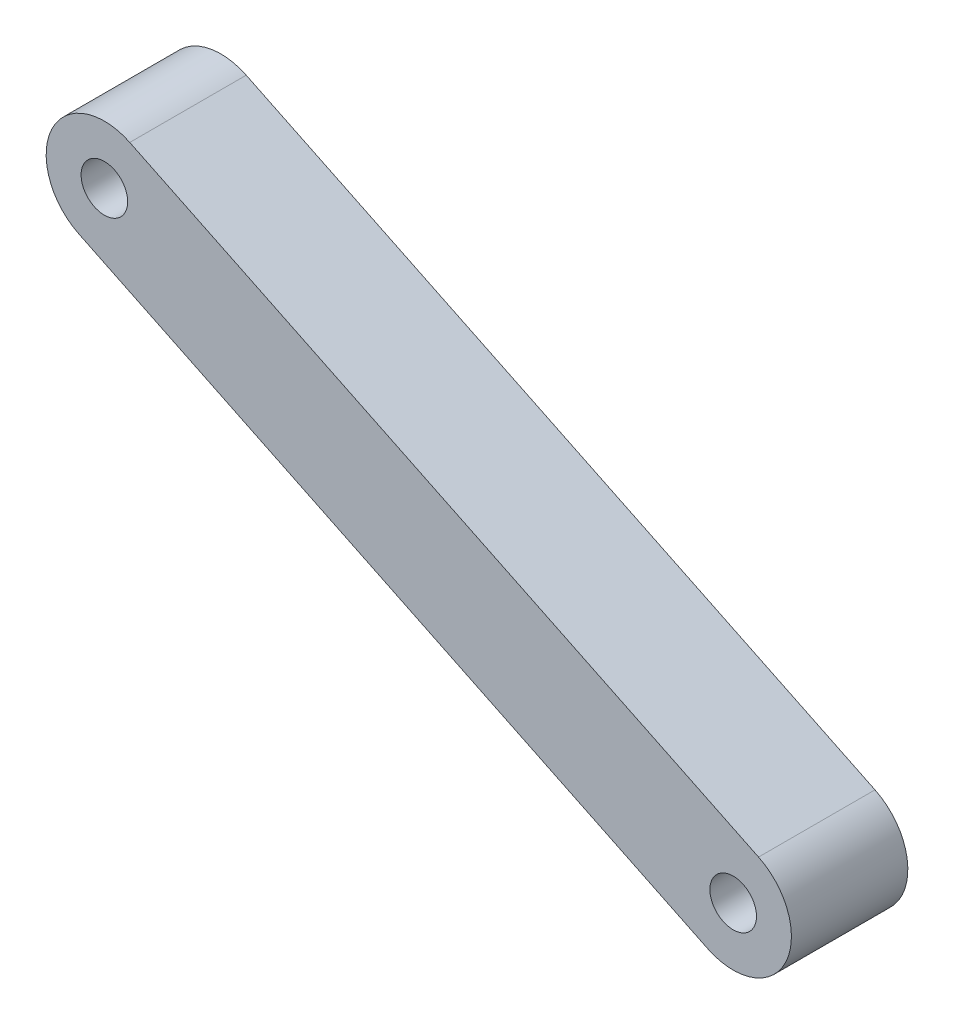
ISO-10303-21;
HEADER;
FILE_DESCRIPTION(('STEP AP214'),'2;1');
FILE_NAME('part.step','',(''),(''),'','','');
FILE_SCHEMA(('AUTOMOTIVE_DESIGN { 1 0 10303 214 1 1 1 1 }'));
ENDSEC;
DATA;
#1=APPLICATION_CONTEXT('core data for automotive mechanical design processes');
#2=APPLICATION_PROTOCOL_DEFINITION('international standard','automotive_design',2000,#1);
#3=PRODUCT_CONTEXT('',#1,'mechanical');
#4=PRODUCT('Part','Part','',(#3));
#5=PRODUCT_RELATED_PRODUCT_CATEGORY('part','',(#4));
#6=PRODUCT_DEFINITION_FORMATION('','',#4);
#7=PRODUCT_DEFINITION_CONTEXT('part definition',#1,'design');
#8=PRODUCT_DEFINITION('design','',#6,#7);
#9=PRODUCT_DEFINITION_SHAPE('','',#8);
#10=(LENGTH_UNIT() NAMED_UNIT(*) SI_UNIT(.MILLI.,.METRE.));
#11=(NAMED_UNIT(*) PLANE_ANGLE_UNIT() SI_UNIT($,.RADIAN.));
#12=(NAMED_UNIT(*) SI_UNIT($,.STERADIAN.) SOLID_ANGLE_UNIT());
#13=UNCERTAINTY_MEASURE_WITH_UNIT(LENGTH_MEASURE(1.E-05),#10,'distance_accuracy_value','');
#14=(GEOMETRIC_REPRESENTATION_CONTEXT(3) GLOBAL_UNCERTAINTY_ASSIGNED_CONTEXT((#13)) GLOBAL_UNIT_ASSIGNED_CONTEXT((#10,
#11,#12)) REPRESENTATION_CONTEXT('',''));
#15=CARTESIAN_POINT('',(0.,0.,0.));
#16=DIRECTION('',(0.,0.,1.));
#17=DIRECTION('',(1.,0.,0.));
#18=AXIS2_PLACEMENT_3D('',#15,#16,#17);
#19=CARTESIAN_POINT('',(-59.1343390927748,15.7528711445072,10.));
#20=DIRECTION('',(0.,0.,1.));
#21=DIRECTION('',(1.,0.,0.));
#22=AXIS2_PLACEMENT_3D('',#19,#20,#21);
#23=PLANE('',#22);
#24=CARTESIAN_POINT('',(-59.1343390927748,15.7528711445072,10.));
#25=DIRECTION('',(0.,0.,1.));
#26=DIRECTION('',(1.,0.,0.));
#27=AXIS2_PLACEMENT_3D('',#24,#25,#26);
#28=CIRCLE('',#27,2.);
#29=CARTESIAN_POINT('',(-57.1343390927748,15.7528711445072,10.));
#30=VERTEX_POINT('',#29);
#31=EDGE_CURVE('E103',#30,#30,#28,.T.);
#32=ORIENTED_EDGE('',*,*,#31,.F.);
#33=EDGE_LOOP('',(#32));
#34=FACE_BOUND('',#33,.T.);
#35=CARTESIAN_POINT('',(-59.1343390927748,15.7528711445072,10.));
#36=DIRECTION('',(0.,0.,1.));
#37=DIRECTION('',(1.,0.,0.));
#38=AXIS2_PLACEMENT_3D('',#35,#36,#37);
#39=CIRCLE('',#38,5.);
#40=CARTESIAN_POINT('',(-56.9551455274455,20.2529950766703,10.));
#41=VERTEX_POINT('',#40);
#42=CARTESIAN_POINT('',(-61.3135326581041,11.252747212344,10.));
#43=VERTEX_POINT('',#42);
#44=EDGE_CURVE('E88',#41,#43,#39,.T.);
#45=ORIENTED_EDGE('',*,*,#44,.T.);
#46=DIRECTION('',(0.900024786432626,-0.435838713065861,0.));
#47=VECTOR('',#46,1.);
#48=CARTESIAN_POINT('',(-61.3135326581041,11.252747212344,10.));
#49=LINE('',#48,#47);
#50=CARTESIAN_POINT('',(-7.31204547214655,-14.8975755716076,10.));
#51=VERTEX_POINT('',#50);
#52=EDGE_CURVE('E83',#43,#51,#49,.T.);
#53=ORIENTED_EDGE('',*,*,#52,.T.);
#54=CARTESIAN_POINT('',(-5.13285190681724,-10.3974516394445,10.));
#55=DIRECTION('',(0.,0.,1.));
#56=DIRECTION('',(1.,0.,0.));
#57=AXIS2_PLACEMENT_3D('',#54,#55,#56);
#58=CIRCLE('',#57,5.);
#59=CARTESIAN_POINT('',(-2.95365834148794,-5.89732770728137,10.));
#60=VERTEX_POINT('',#59);
#61=EDGE_CURVE('E86',#51,#60,#58,.T.);
#62=ORIENTED_EDGE('',*,*,#61,.T.);
#63=DIRECTION('',(-0.900024786432626,0.435838713065861,0.));
#64=VECTOR('',#63,1.);
#65=CARTESIAN_POINT('',(-56.9551455274455,20.2529950766703,10.));
#66=LINE('',#65,#64);
#67=EDGE_CURVE('E53',#60,#41,#66,.T.);
#68=ORIENTED_EDGE('',*,*,#67,.T.);
#69=EDGE_LOOP('',(#45,#53,#62,#68));
#70=FACE_BOUND('',#69,.T.);
#71=CARTESIAN_POINT('',(-5.13285190681724,-10.3974516394445,10.));
#72=DIRECTION('',(0.,0.,1.));
#73=DIRECTION('',(1.,0.,0.));
#74=AXIS2_PLACEMENT_3D('',#71,#72,#73);
#75=CIRCLE('',#74,2.);
#76=CARTESIAN_POINT('',(-3.13285190681724,-10.3974516394445,10.));
#77=VERTEX_POINT('',#76);
#78=EDGE_CURVE('E118',#77,#77,#75,.T.);
#79=ORIENTED_EDGE('',*,*,#78,.F.);
#80=EDGE_LOOP('',(#79));
#81=FACE_BOUND('',#80,.T.);
#82=ADVANCED_FACE('F36',(#34,#70,#81),#23,.T.);
#83=CARTESIAN_POINT('',(-59.1343390927748,15.7528711445072,0.));
#84=DIRECTION('',(0.,0.,1.));
#85=DIRECTION('',(1.,0.,0.));
#86=AXIS2_PLACEMENT_3D('',#83,#84,#85);
#87=PLANE('',#86);
#88=CARTESIAN_POINT('',(-59.1343390927748,15.7528711445072,0.));
#89=DIRECTION('',(0.,0.,1.));
#90=DIRECTION('',(1.,0.,0.));
#91=AXIS2_PLACEMENT_3D('',#88,#89,#90);
#92=CIRCLE('',#91,5.);
#93=CARTESIAN_POINT('',(-56.9551455274455,20.2529950766703,0.));
#94=VERTEX_POINT('',#93);
#95=CARTESIAN_POINT('',(-61.3135326581041,11.252747212344,0.));
#96=VERTEX_POINT('',#95);
#97=EDGE_CURVE('E100',#94,#96,#92,.T.);
#98=ORIENTED_EDGE('',*,*,#97,.F.);
#99=DIRECTION('',(-0.900024786432626,0.435838713065861,0.));
#100=VECTOR('',#99,1.);
#101=CARTESIAN_POINT('',(-56.9551455274455,20.2529950766703,0.));
#102=LINE('',#101,#100);
#103=CARTESIAN_POINT('',(-2.95365834148794,-5.89732770728137,0.));
#104=VERTEX_POINT('',#103);
#105=EDGE_CURVE('E76',#104,#94,#102,.T.);
#106=ORIENTED_EDGE('',*,*,#105,.F.);
#107=CARTESIAN_POINT('',(-5.13285190681724,-10.3974516394445,0.));
#108=DIRECTION('',(0.,0.,1.));
#109=DIRECTION('',(1.,0.,0.));
#110=AXIS2_PLACEMENT_3D('',#107,#108,#109);
#111=CIRCLE('',#110,5.);
#112=CARTESIAN_POINT('',(-7.31204547214655,-14.8975755716076,0.));
#113=VERTEX_POINT('',#112);
#114=EDGE_CURVE('E70',#113,#104,#111,.T.);
#115=ORIENTED_EDGE('',*,*,#114,.F.);
#116=DIRECTION('',(0.900024786432626,-0.435838713065861,0.));
#117=VECTOR('',#116,1.);
#118=CARTESIAN_POINT('',(-61.3135326581041,11.252747212344,0.));
#119=LINE('',#118,#117);
#120=EDGE_CURVE('E92',#96,#113,#119,.T.);
#121=ORIENTED_EDGE('',*,*,#120,.F.);
#122=EDGE_LOOP('',(#98,#106,#115,#121));
#123=FACE_BOUND('',#122,.T.);
#124=CARTESIAN_POINT('',(-59.1343390927748,15.7528711445072,0.));
#125=DIRECTION('',(0.,0.,1.));
#126=DIRECTION('',(1.,0.,0.));
#127=AXIS2_PLACEMENT_3D('',#124,#125,#126);
#128=CIRCLE('',#127,2.);
#129=CARTESIAN_POINT('',(-57.1343390927748,15.7528711445072,0.));
#130=VERTEX_POINT('',#129);
#131=EDGE_CURVE('E115',#130,#130,#128,.T.);
#132=ORIENTED_EDGE('',*,*,#131,.T.);
#133=EDGE_LOOP('',(#132));
#134=FACE_BOUND('',#133,.T.);
#135=CARTESIAN_POINT('',(-5.13285190681724,-10.3974516394445,0.));
#136=DIRECTION('',(0.,0.,1.));
#137=DIRECTION('',(1.,0.,0.));
#138=AXIS2_PLACEMENT_3D('',#135,#136,#137);
#139=CIRCLE('',#138,2.);
#140=CARTESIAN_POINT('',(-3.13285190681724,-10.3974516394445,0.));
#141=VERTEX_POINT('',#140);
#142=EDGE_CURVE('E121',#141,#141,#139,.T.);
#143=ORIENTED_EDGE('',*,*,#142,.T.);
#144=EDGE_LOOP('',(#143));
#145=FACE_BOUND('',#144,.T.);
#146=ADVANCED_FACE('F111',(#123,#134,#145),#87,.F.);
#147=CARTESIAN_POINT('',(-59.1343390927748,15.7528711445072,10.));
#148=DIRECTION('',(0.,0.,-1.));
#149=DIRECTION('',(-1.,0.,0.));
#150=AXIS2_PLACEMENT_3D('',#147,#148,#149);
#151=CYLINDRICAL_SURFACE('',#150,5.);
#152=ORIENTED_EDGE('',*,*,#97,.T.);
#153=DIRECTION('',(0.,0.,-1.));
#154=VECTOR('',#153,1.);
#155=CARTESIAN_POINT('',(-61.3135326581041,11.252747212344,10.));
#156=LINE('',#155,#154);
#157=EDGE_CURVE('E11',#43,#96,#156,.T.);
#158=ORIENTED_EDGE('',*,*,#157,.F.);
#159=ORIENTED_EDGE('',*,*,#44,.F.);
#160=DIRECTION('',(0.,0.,-1.));
#161=VECTOR('',#160,1.);
#162=CARTESIAN_POINT('',(-56.9551455274455,20.2529950766703,10.));
#163=LINE('',#162,#161);
#164=EDGE_CURVE('E96',#41,#94,#163,.T.);
#165=ORIENTED_EDGE('',*,*,#164,.T.);
#166=EDGE_LOOP('',(#152,#158,#159,#165));
#167=FACE_BOUND('',#166,.T.);
#168=ADVANCED_FACE('F38',(#167),#151,.T.);
#169=CARTESIAN_POINT('',(-61.3135326581041,11.252747212344,10.));
#170=DIRECTION('',(0.435838713065861,0.900024786432626,0.));
#171=DIRECTION('',(-0.900024786432626,0.435838713065861,0.));
#172=AXIS2_PLACEMENT_3D('',#169,#170,#171);
#173=PLANE('',#172);
#174=ORIENTED_EDGE('',*,*,#120,.T.);
#175=DIRECTION('',(0.,0.,-1.));
#176=VECTOR('',#175,1.);
#177=CARTESIAN_POINT('',(-7.31204547214655,-14.8975755716076,10.));
#178=LINE('',#177,#176);
#179=EDGE_CURVE('E45',#51,#113,#178,.T.);
#180=ORIENTED_EDGE('',*,*,#179,.F.);
#181=ORIENTED_EDGE('',*,*,#52,.F.);
#182=ORIENTED_EDGE('',*,*,#157,.T.);
#183=EDGE_LOOP('',(#174,#180,#181,#182));
#184=FACE_BOUND('',#183,.T.);
#185=ADVANCED_FACE('F91',(#184),#173,.F.);
#186=CARTESIAN_POINT('',(-5.13285190681724,-10.3974516394445,10.));
#187=DIRECTION('',(0.,0.,-1.));
#188=DIRECTION('',(-1.,0.,0.));
#189=AXIS2_PLACEMENT_3D('',#186,#187,#188);
#190=CYLINDRICAL_SURFACE('',#189,5.);
#191=ORIENTED_EDGE('',*,*,#114,.T.);
#192=DIRECTION('',(0.,0.,-1.));
#193=VECTOR('',#192,1.);
#194=CARTESIAN_POINT('',(-2.95365834148794,-5.89732770728137,10.));
#195=LINE('',#194,#193);
#196=EDGE_CURVE('E93',#60,#104,#195,.T.);
#197=ORIENTED_EDGE('',*,*,#196,.F.);
#198=ORIENTED_EDGE('',*,*,#61,.F.);
#199=ORIENTED_EDGE('',*,*,#179,.T.);
#200=EDGE_LOOP('',(#191,#197,#198,#199));
#201=FACE_BOUND('',#200,.T.);
#202=ADVANCED_FACE('F94',(#201),#190,.T.);
#203=CARTESIAN_POINT('',(-56.9551455274455,20.2529950766703,10.));
#204=DIRECTION('',(-0.435838713065861,-0.900024786432626,0.));
#205=DIRECTION('',(0.900024786432626,-0.435838713065861,0.));
#206=AXIS2_PLACEMENT_3D('',#203,#204,#205);
#207=PLANE('',#206);
#208=ORIENTED_EDGE('',*,*,#105,.T.);
#209=ORIENTED_EDGE('',*,*,#164,.F.);
#210=ORIENTED_EDGE('',*,*,#67,.F.);
#211=ORIENTED_EDGE('',*,*,#196,.T.);
#212=EDGE_LOOP('',(#208,#209,#210,#211));
#213=FACE_BOUND('',#212,.T.);
#214=ADVANCED_FACE('F108',(#213),#207,.F.);
#215=CARTESIAN_POINT('',(-59.1343390927748,15.7528711445072,10.));
#216=DIRECTION('',(0.,0.,-1.));
#217=DIRECTION('',(-1.,0.,0.));
#218=AXIS2_PLACEMENT_3D('',#215,#216,#217);
#219=CYLINDRICAL_SURFACE('',#218,2.);
#220=ORIENTED_EDGE('',*,*,#31,.T.);
#221=EDGE_LOOP('',(#220));
#222=FACE_BOUND('',#221,.T.);
#223=ORIENTED_EDGE('',*,*,#131,.F.);
#224=EDGE_LOOP('',(#223));
#225=FACE_BOUND('',#224,.T.);
#226=ADVANCED_FACE('F138',(#222,#225),#219,.F.);
#227=CARTESIAN_POINT('',(-5.13285190681724,-10.3974516394445,10.));
#228=DIRECTION('',(0.,0.,-1.));
#229=DIRECTION('',(-1.,0.,0.));
#230=AXIS2_PLACEMENT_3D('',#227,#228,#229);
#231=CYLINDRICAL_SURFACE('',#230,2.);
#232=ORIENTED_EDGE('',*,*,#78,.T.);
#233=EDGE_LOOP('',(#232));
#234=FACE_BOUND('',#233,.T.);
#235=ORIENTED_EDGE('',*,*,#142,.F.);
#236=EDGE_LOOP('',(#235));
#237=FACE_BOUND('',#236,.T.);
#238=ADVANCED_FACE('F127',(#234,#237),#231,.F.);
#239=CLOSED_SHELL('',(#82,#146,#168,#185,#202,#214,#226,#238));
#240=MANIFOLD_SOLID_BREP('B2',#239);
#241=ADVANCED_BREP_SHAPE_REPRESENTATION('',(#18,#240),#14);
#242=SHAPE_DEFINITION_REPRESENTATION(#9,#241);
ENDSEC;
END-ISO-10303-21;
